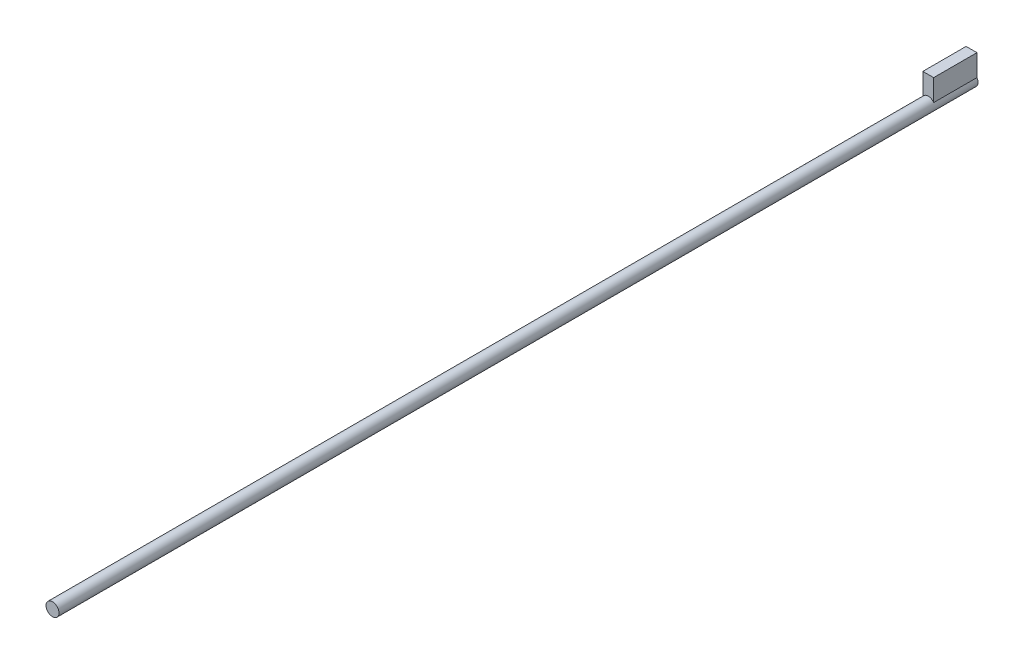
ISO-10303-21;
HEADER;
FILE_DESCRIPTION(('STEP AP214'),'2;1');
FILE_NAME('part.step','',(''),(''),'','','');
FILE_SCHEMA(('AUTOMOTIVE_DESIGN { 1 0 10303 214 1 1 1 1 }'));
ENDSEC;
DATA;
#1=APPLICATION_CONTEXT('core data for automotive mechanical design processes');
#2=APPLICATION_PROTOCOL_DEFINITION('international standard','automotive_design',2000,#1);
#3=PRODUCT_CONTEXT('',#1,'mechanical');
#4=PRODUCT('Part','Part','',(#3));
#5=PRODUCT_RELATED_PRODUCT_CATEGORY('part','',(#4));
#6=PRODUCT_DEFINITION_FORMATION('','',#4);
#7=PRODUCT_DEFINITION_CONTEXT('part definition',#1,'design');
#8=PRODUCT_DEFINITION('design','',#6,#7);
#9=PRODUCT_DEFINITION_SHAPE('','',#8);
#10=(LENGTH_UNIT() NAMED_UNIT(*) SI_UNIT(.MILLI.,.METRE.));
#11=(NAMED_UNIT(*) PLANE_ANGLE_UNIT() SI_UNIT($,.RADIAN.));
#12=(NAMED_UNIT(*) SI_UNIT($,.STERADIAN.) SOLID_ANGLE_UNIT());
#13=UNCERTAINTY_MEASURE_WITH_UNIT(LENGTH_MEASURE(1.E-05),#10,'distance_accuracy_value','');
#14=(GEOMETRIC_REPRESENTATION_CONTEXT(3) GLOBAL_UNCERTAINTY_ASSIGNED_CONTEXT((#13)) GLOBAL_UNIT_ASSIGNED_CONTEXT((#10,
#11,#12)) REPRESENTATION_CONTEXT('',''));
#15=CARTESIAN_POINT('',(0.,0.,0.));
#16=DIRECTION('',(0.,0.,1.));
#17=DIRECTION('',(1.,0.,0.));
#18=AXIS2_PLACEMENT_3D('',#15,#16,#17);
#19=CARTESIAN_POINT('',(0.,0.,212.4));
#20=DIRECTION('',(0.,0.,-1.));
#21=DIRECTION('',(-1.,0.,0.));
#22=AXIS2_PLACEMENT_3D('',#19,#20,#21);
#23=CYLINDRICAL_SURFACE('',#22,1.5);
#24=CARTESIAN_POINT('',(0.,0.,10.));
#25=DIRECTION('',(0.,0.,-1.));
#26=DIRECTION('',(-1.,0.,0.));
#27=AXIS2_PLACEMENT_3D('',#24,#25,#26);
#28=CIRCLE('',#27,1.5);
#29=CARTESIAN_POINT('',(-1.25,0.829156197588851,10.));
#30=VERTEX_POINT('',#29);
#31=CARTESIAN_POINT('',(1.25,0.829156197588851,10.));
#32=VERTEX_POINT('',#31);
#33=EDGE_CURVE('E60',#30,#32,#28,.T.);
#34=ORIENTED_EDGE('',*,*,#33,.F.);
#35=DIRECTION('',(0.,0.,-1.));
#36=VECTOR('',#35,1.);
#37=CARTESIAN_POINT('',(-1.25,0.829156197588851,10.));
#38=LINE('',#37,#36);
#39=CARTESIAN_POINT('',(-1.25,0.829156197588851,0.));
#40=VERTEX_POINT('',#39);
#41=EDGE_CURVE('E122',#30,#40,#38,.T.);
#42=ORIENTED_EDGE('',*,*,#41,.T.);
#43=CARTESIAN_POINT('',(0.,0.,0.));
#44=DIRECTION('',(0.,0.,1.));
#45=DIRECTION('',(1.,0.,0.));
#46=AXIS2_PLACEMENT_3D('',#43,#44,#45);
#47=CIRCLE('',#46,1.5);
#48=CARTESIAN_POINT('',(1.25,0.829156197588851,0.));
#49=VERTEX_POINT('',#48);
#50=EDGE_CURVE('E44',#40,#49,#47,.T.);
#51=ORIENTED_EDGE('',*,*,#50,.T.);
#52=DIRECTION('',(0.,0.,-1.));
#53=VECTOR('',#52,1.);
#54=CARTESIAN_POINT('',(1.25,0.829156197588851,10.));
#55=LINE('',#54,#53);
#56=EDGE_CURVE('E56',#32,#49,#55,.T.);
#57=ORIENTED_EDGE('',*,*,#56,.F.);
#58=EDGE_LOOP('',(#34,#42,#51,#57));
#59=FACE_BOUND('',#58,.T.);
#60=CARTESIAN_POINT('',(0.,0.,212.4));
#61=DIRECTION('',(0.,0.,1.));
#62=DIRECTION('',(1.,0.,0.));
#63=AXIS2_PLACEMENT_3D('',#60,#61,#62);
#64=CIRCLE('',#63,1.5);
#65=CARTESIAN_POINT('',(1.5,0.,212.4));
#66=VERTEX_POINT('',#65);
#67=EDGE_CURVE('E11',#66,#66,#64,.T.);
#68=ORIENTED_EDGE('',*,*,#67,.F.);
#69=EDGE_LOOP('',(#68));
#70=FACE_BOUND('',#69,.T.);
#71=ADVANCED_FACE('F41',(#59,#70),#23,.T.);
#72=CARTESIAN_POINT('',(0.,0.,212.4));
#73=DIRECTION('',(0.,0.,1.));
#74=DIRECTION('',(1.,0.,0.));
#75=AXIS2_PLACEMENT_3D('',#72,#73,#74);
#76=PLANE('',#75);
#77=ORIENTED_EDGE('',*,*,#67,.T.);
#78=EDGE_LOOP('',(#77));
#79=FACE_BOUND('',#78,.T.);
#80=ADVANCED_FACE('F134',(#79),#76,.T.);
#81=CARTESIAN_POINT('',(0.,0.,0.));
#82=DIRECTION('',(0.,0.,1.));
#83=DIRECTION('',(1.,0.,0.));
#84=AXIS2_PLACEMENT_3D('',#81,#82,#83);
#85=PLANE('',#84);
#86=ORIENTED_EDGE('',*,*,#50,.F.);
#87=DIRECTION('',(0.,1.,0.));
#88=VECTOR('',#87,1.);
#89=CARTESIAN_POINT('',(-1.25,0.,0.));
#90=LINE('',#89,#88);
#91=CARTESIAN_POINT('',(-1.25,5.82915619758885,0.));
#92=VERTEX_POINT('',#91);
#93=EDGE_CURVE('E105',#40,#92,#90,.T.);
#94=ORIENTED_EDGE('',*,*,#93,.T.);
#95=DIRECTION('',(-1.,0.,0.));
#96=VECTOR('',#95,1.);
#97=CARTESIAN_POINT('',(0.,5.82915619758885,0.));
#98=LINE('',#97,#96);
#99=CARTESIAN_POINT('',(1.25,5.82915619758885,0.));
#100=VERTEX_POINT('',#99);
#101=EDGE_CURVE('E115',#100,#92,#98,.T.);
#102=ORIENTED_EDGE('',*,*,#101,.F.);
#103=DIRECTION('',(0.,1.,0.));
#104=VECTOR('',#103,1.);
#105=CARTESIAN_POINT('',(1.25,0.,0.));
#106=LINE('',#105,#104);
#107=EDGE_CURVE('E94',#49,#100,#106,.T.);
#108=ORIENTED_EDGE('',*,*,#107,.F.);
#109=EDGE_LOOP('',(#86,#94,#102,#108));
#110=FACE_BOUND('',#109,.T.);
#111=ADVANCED_FACE('F127',(#110),#85,.F.);
#112=CARTESIAN_POINT('',(0.,5.82915619758885,10.));
#113=DIRECTION('',(0.,-1.,0.));
#114=DIRECTION('',(0.,0.,-1.));
#115=AXIS2_PLACEMENT_3D('',#112,#113,#114);
#116=PLANE('',#115);
#117=ORIENTED_EDGE('',*,*,#101,.T.);
#118=DIRECTION('',(0.,0.,-1.));
#119=VECTOR('',#118,1.);
#120=CARTESIAN_POINT('',(-1.25,5.82915619758885,10.));
#121=LINE('',#120,#119);
#122=CARTESIAN_POINT('',(-1.25,5.82915619758885,10.));
#123=VERTEX_POINT('',#122);
#124=EDGE_CURVE('E102',#123,#92,#121,.T.);
#125=ORIENTED_EDGE('',*,*,#124,.F.);
#126=DIRECTION('',(-1.,0.,0.));
#127=VECTOR('',#126,1.);
#128=CARTESIAN_POINT('',(0.,5.82915619758885,10.));
#129=LINE('',#128,#127);
#130=CARTESIAN_POINT('',(1.25,5.82915619758885,10.));
#131=VERTEX_POINT('',#130);
#132=EDGE_CURVE('E85',#131,#123,#129,.T.);
#133=ORIENTED_EDGE('',*,*,#132,.F.);
#134=DIRECTION('',(0.,0.,-1.));
#135=VECTOR('',#134,1.);
#136=CARTESIAN_POINT('',(1.25,5.82915619758885,10.));
#137=LINE('',#136,#135);
#138=EDGE_CURVE('E91',#131,#100,#137,.T.);
#139=ORIENTED_EDGE('',*,*,#138,.T.);
#140=EDGE_LOOP('',(#117,#125,#133,#139));
#141=FACE_BOUND('',#140,.T.);
#142=ADVANCED_FACE('F101',(#141),#116,.F.);
#143=CARTESIAN_POINT('',(-1.25,0.,10.));
#144=DIRECTION('',(-1.,0.,0.));
#145=DIRECTION('',(0.,-1.,0.));
#146=AXIS2_PLACEMENT_3D('',#143,#144,#145);
#147=PLANE('',#146);
#148=ORIENTED_EDGE('',*,*,#93,.F.);
#149=ORIENTED_EDGE('',*,*,#41,.F.);
#150=DIRECTION('',(0.,1.,0.));
#151=VECTOR('',#150,1.);
#152=CARTESIAN_POINT('',(-1.25,0.,10.));
#153=LINE('',#152,#151);
#154=EDGE_CURVE('E99',#30,#123,#153,.T.);
#155=ORIENTED_EDGE('',*,*,#154,.T.);
#156=ORIENTED_EDGE('',*,*,#124,.T.);
#157=EDGE_LOOP('',(#148,#149,#155,#156));
#158=FACE_BOUND('',#157,.T.);
#159=ADVANCED_FACE('F130',(#158),#147,.T.);
#160=CARTESIAN_POINT('',(1.25,0.,10.));
#161=DIRECTION('',(-1.,0.,0.));
#162=DIRECTION('',(0.,-1.,0.));
#163=AXIS2_PLACEMENT_3D('',#160,#161,#162);
#164=PLANE('',#163);
#165=ORIENTED_EDGE('',*,*,#107,.T.);
#166=ORIENTED_EDGE('',*,*,#138,.F.);
#167=DIRECTION('',(0.,1.,0.));
#168=VECTOR('',#167,1.);
#169=CARTESIAN_POINT('',(1.25,0.,10.));
#170=LINE('',#169,#168);
#171=EDGE_CURVE('E80',#32,#131,#170,.T.);
#172=ORIENTED_EDGE('',*,*,#171,.F.);
#173=ORIENTED_EDGE('',*,*,#56,.T.);
#174=EDGE_LOOP('',(#165,#166,#172,#173));
#175=FACE_BOUND('',#174,.T.);
#176=ADVANCED_FACE('F92',(#175),#164,.F.);
#177=CARTESIAN_POINT('',(0.,0.,10.));
#178=DIRECTION('',(0.,0.,-1.));
#179=DIRECTION('',(-1.,0.,0.));
#180=AXIS2_PLACEMENT_3D('',#177,#178,#179);
#181=PLANE('',#180);
#182=ORIENTED_EDGE('',*,*,#132,.T.);
#183=ORIENTED_EDGE('',*,*,#154,.F.);
#184=ORIENTED_EDGE('',*,*,#33,.T.);
#185=ORIENTED_EDGE('',*,*,#171,.T.);
#186=EDGE_LOOP('',(#182,#183,#184,#185));
#187=FACE_BOUND('',#186,.T.);
#188=ADVANCED_FACE('F82',(#187),#181,.F.);
#189=CLOSED_SHELL('',(#71,#80,#111,#142,#159,#176,#188));
#190=MANIFOLD_SOLID_BREP('B2',#189);
#191=ADVANCED_BREP_SHAPE_REPRESENTATION('',(#18,#190),#14);
#192=SHAPE_DEFINITION_REPRESENTATION(#9,#191);
ENDSEC;
END-ISO-10303-21;
